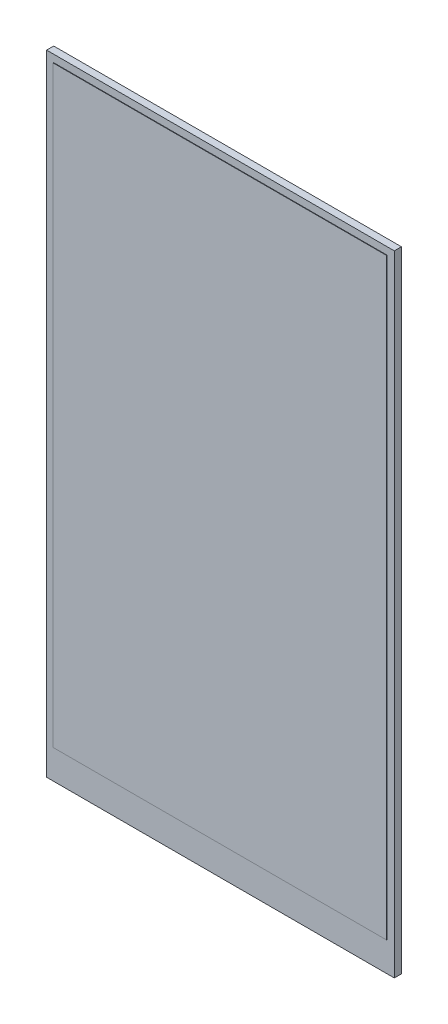
ISO-10303-21;
HEADER;
FILE_DESCRIPTION(('STEP AP214'),'2;1');
FILE_NAME('part.step','',(''),(''),'','','');
FILE_SCHEMA(('AUTOMOTIVE_DESIGN { 1 0 10303 214 1 1 1 1 }'));
ENDSEC;
DATA;
#1=APPLICATION_CONTEXT('core data for automotive mechanical design processes');
#2=APPLICATION_PROTOCOL_DEFINITION('international standard','automotive_design',2000,#1);
#3=PRODUCT_CONTEXT('',#1,'mechanical');
#4=PRODUCT('Part','Part','',(#3));
#5=PRODUCT_RELATED_PRODUCT_CATEGORY('part','',(#4));
#6=PRODUCT_DEFINITION_FORMATION('','',#4);
#7=PRODUCT_DEFINITION_CONTEXT('part definition',#1,'design');
#8=PRODUCT_DEFINITION('design','',#6,#7);
#9=PRODUCT_DEFINITION_SHAPE('','',#8);
#10=(LENGTH_UNIT() NAMED_UNIT(*) SI_UNIT(.MILLI.,.METRE.));
#11=(NAMED_UNIT(*) PLANE_ANGLE_UNIT() SI_UNIT($,.RADIAN.));
#12=(NAMED_UNIT(*) SI_UNIT($,.STERADIAN.) SOLID_ANGLE_UNIT());
#13=UNCERTAINTY_MEASURE_WITH_UNIT(LENGTH_MEASURE(1.E-05),#10,'distance_accuracy_value','');
#14=(GEOMETRIC_REPRESENTATION_CONTEXT(3) GLOBAL_UNCERTAINTY_ASSIGNED_CONTEXT((#13)) GLOBAL_UNIT_ASSIGNED_CONTEXT((#10,
#11,#12)) REPRESENTATION_CONTEXT('',''));
#15=CARTESIAN_POINT('',(0.,0.,0.));
#16=DIRECTION('',(0.,0.,1.));
#17=DIRECTION('',(1.,0.,0.));
#18=AXIS2_PLACEMENT_3D('',#15,#16,#17);
#19=CARTESIAN_POINT('',(0.,0.,1.45));
#20=DIRECTION('',(0.,0.,-1.));
#21=DIRECTION('',(-1.,0.,0.));
#22=AXIS2_PLACEMENT_3D('',#19,#20,#21);
#23=PLANE('',#22);
#24=DIRECTION('',(0.,-1.,0.));
#25=VECTOR('',#24,1.);
#26=CARTESIAN_POINT('',(0.,0.,1.45));
#27=LINE('',#26,#25);
#28=CARTESIAN_POINT('',(0.,128.49,1.45));
#29=VERTEX_POINT('',#28);
#30=CARTESIAN_POINT('',(0.,0.,1.45));
#31=VERTEX_POINT('',#30);
#32=EDGE_CURVE('E141',#29,#31,#27,.T.);
#33=ORIENTED_EDGE('',*,*,#32,.T.);
#34=DIRECTION('',(1.,0.,0.));
#35=VECTOR('',#34,1.);
#36=CARTESIAN_POINT('',(0.,0.,1.45));
#37=LINE('',#36,#35);
#38=CARTESIAN_POINT('',(70.94,0.,1.45));
#39=VERTEX_POINT('',#38);
#40=EDGE_CURVE('E145',#31,#39,#37,.T.);
#41=ORIENTED_EDGE('',*,*,#40,.T.);
#42=DIRECTION('',(0.,1.,0.));
#43=VECTOR('',#42,1.);
#44=CARTESIAN_POINT('',(70.94,0.,1.45));
#45=LINE('',#44,#43);
#46=CARTESIAN_POINT('',(70.94,128.49,1.45));
#47=VERTEX_POINT('',#46);
#48=EDGE_CURVE('E149',#39,#47,#45,.T.);
#49=ORIENTED_EDGE('',*,*,#48,.T.);
#50=DIRECTION('',(-1.,0.,0.));
#51=VECTOR('',#50,1.);
#52=CARTESIAN_POINT('',(0.,128.49,1.45));
#53=LINE('',#52,#51);
#54=EDGE_CURVE('E152',#47,#29,#53,.T.);
#55=ORIENTED_EDGE('',*,*,#54,.T.);
#56=EDGE_LOOP('',(#33,#41,#49,#55));
#57=FACE_BOUND('',#56,.T.);
#58=DIRECTION('',(0.,1.,0.));
#59=VECTOR('',#58,1.);
#60=CARTESIAN_POINT('',(69.49,6.03000000000002,1.45));
#61=LINE('',#60,#59);
#62=CARTESIAN_POINT('',(69.49,6.03000000000002,1.45));
#63=VERTEX_POINT('',#62);
#64=CARTESIAN_POINT('',(69.49,126.99,1.45));
#65=VERTEX_POINT('',#64);
#66=EDGE_CURVE('E57',#63,#65,#61,.T.);
#67=ORIENTED_EDGE('',*,*,#66,.F.);
#68=DIRECTION('',(1.,0.,0.));
#69=VECTOR('',#68,1.);
#70=CARTESIAN_POINT('',(69.49,6.03000000000002,1.45));
#71=LINE('',#70,#69);
#72=CARTESIAN_POINT('',(1.44999999999999,6.03000000000001,1.45));
#73=VERTEX_POINT('',#72);
#74=EDGE_CURVE('E61',#73,#63,#71,.T.);
#75=ORIENTED_EDGE('',*,*,#74,.F.);
#76=DIRECTION('',(0.,-1.,0.));
#77=VECTOR('',#76,1.);
#78=CARTESIAN_POINT('',(1.44999999999999,6.03000000000001,1.45));
#79=LINE('',#78,#77);
#80=CARTESIAN_POINT('',(1.44999999999999,126.99,1.45));
#81=VERTEX_POINT('',#80);
#82=EDGE_CURVE('E287',#81,#73,#79,.T.);
#83=ORIENTED_EDGE('',*,*,#82,.F.);
#84=DIRECTION('',(-1.,0.,0.));
#85=VECTOR('',#84,1.);
#86=CARTESIAN_POINT('',(69.49,126.99,1.45));
#87=LINE('',#86,#85);
#88=EDGE_CURVE('E297',#65,#81,#87,.T.);
#89=ORIENTED_EDGE('',*,*,#88,.F.);
#90=EDGE_LOOP('',(#67,#75,#83,#89));
#91=FACE_BOUND('',#90,.T.);
#92=ADVANCED_FACE('F41',(#57,#91),#23,.F.);
#93=CARTESIAN_POINT('',(0.,0.,1.45));
#94=DIRECTION('',(1.,0.,0.));
#95=DIRECTION('',(0.,0.,-1.));
#96=AXIS2_PLACEMENT_3D('',#93,#94,#95);
#97=PLANE('',#96);
#98=DIRECTION('',(0.,-1.,0.));
#99=VECTOR('',#98,1.);
#100=CARTESIAN_POINT('',(0.,0.,0.));
#101=LINE('',#100,#99);
#102=CARTESIAN_POINT('',(0.,128.49,0.));
#103=VERTEX_POINT('',#102);
#104=CARTESIAN_POINT('',(0.,0.,0.));
#105=VERTEX_POINT('',#104);
#106=EDGE_CURVE('E130',#103,#105,#101,.T.);
#107=ORIENTED_EDGE('',*,*,#106,.T.);
#108=DIRECTION('',(0.,0.,-1.));
#109=VECTOR('',#108,1.);
#110=CARTESIAN_POINT('',(0.,0.,1.45));
#111=LINE('',#110,#109);
#112=EDGE_CURVE('E11',#31,#105,#111,.T.);
#113=ORIENTED_EDGE('',*,*,#112,.F.);
#114=ORIENTED_EDGE('',*,*,#32,.F.);
#115=DIRECTION('',(0.,0.,-1.));
#116=VECTOR('',#115,1.);
#117=CARTESIAN_POINT('',(0.,128.49,1.45));
#118=LINE('',#117,#116);
#119=EDGE_CURVE('E154',#29,#103,#118,.T.);
#120=ORIENTED_EDGE('',*,*,#119,.T.);
#121=EDGE_LOOP('',(#107,#113,#114,#120));
#122=FACE_BOUND('',#121,.T.);
#123=ADVANCED_FACE('F43',(#122),#97,.F.);
#124=CARTESIAN_POINT('',(0.,0.,1.45));
#125=DIRECTION('',(0.,1.,0.));
#126=DIRECTION('',(0.,0.,1.));
#127=AXIS2_PLACEMENT_3D('',#124,#125,#126);
#128=PLANE('',#127);
#129=DIRECTION('',(1.,0.,0.));
#130=VECTOR('',#129,1.);
#131=CARTESIAN_POINT('',(0.,0.,0.));
#132=LINE('',#131,#130);
#133=CARTESIAN_POINT('',(70.94,0.,0.));
#134=VERTEX_POINT('',#133);
#135=EDGE_CURVE('E135',#105,#134,#132,.T.);
#136=ORIENTED_EDGE('',*,*,#135,.T.);
#137=DIRECTION('',(0.,0.,-1.));
#138=VECTOR('',#137,1.);
#139=CARTESIAN_POINT('',(70.94,0.,1.45));
#140=LINE('',#139,#138);
#141=EDGE_CURVE('E50',#39,#134,#140,.T.);
#142=ORIENTED_EDGE('',*,*,#141,.F.);
#143=ORIENTED_EDGE('',*,*,#40,.F.);
#144=ORIENTED_EDGE('',*,*,#112,.T.);
#145=EDGE_LOOP('',(#136,#142,#143,#144));
#146=FACE_BOUND('',#145,.T.);
#147=ADVANCED_FACE('F190',(#146),#128,.F.);
#148=CARTESIAN_POINT('',(70.94,0.,1.45));
#149=DIRECTION('',(-1.,0.,0.));
#150=DIRECTION('',(0.,-1.,0.));
#151=AXIS2_PLACEMENT_3D('',#148,#149,#150);
#152=PLANE('',#151);
#153=DIRECTION('',(0.,1.,0.));
#154=VECTOR('',#153,1.);
#155=CARTESIAN_POINT('',(70.94,0.,0.));
#156=LINE('',#155,#154);
#157=CARTESIAN_POINT('',(70.94,128.49,0.));
#158=VERTEX_POINT('',#157);
#159=EDGE_CURVE('E158',#134,#158,#156,.T.);
#160=ORIENTED_EDGE('',*,*,#159,.T.);
#161=DIRECTION('',(0.,0.,-1.));
#162=VECTOR('',#161,1.);
#163=CARTESIAN_POINT('',(70.94,128.49,1.45));
#164=LINE('',#163,#162);
#165=EDGE_CURVE('E166',#47,#158,#164,.T.);
#166=ORIENTED_EDGE('',*,*,#165,.F.);
#167=ORIENTED_EDGE('',*,*,#48,.F.);
#168=ORIENTED_EDGE('',*,*,#141,.T.);
#169=EDGE_LOOP('',(#160,#166,#167,#168));
#170=FACE_BOUND('',#169,.T.);
#171=ADVANCED_FACE('F175',(#170),#152,.F.);
#172=CARTESIAN_POINT('',(0.,128.49,1.45));
#173=DIRECTION('',(0.,-1.,0.));
#174=DIRECTION('',(0.,0.,-1.));
#175=AXIS2_PLACEMENT_3D('',#172,#173,#174);
#176=PLANE('',#175);
#177=DIRECTION('',(-1.,0.,0.));
#178=VECTOR('',#177,1.);
#179=CARTESIAN_POINT('',(0.,128.49,0.));
#180=LINE('',#179,#178);
#181=EDGE_CURVE('E146',#158,#103,#180,.T.);
#182=ORIENTED_EDGE('',*,*,#181,.T.);
#183=ORIENTED_EDGE('',*,*,#119,.F.);
#184=ORIENTED_EDGE('',*,*,#54,.F.);
#185=ORIENTED_EDGE('',*,*,#165,.T.);
#186=EDGE_LOOP('',(#182,#183,#184,#185));
#187=FACE_BOUND('',#186,.T.);
#188=ADVANCED_FACE('F184',(#187),#176,.F.);
#189=CARTESIAN_POINT('',(0.,0.,0.));
#190=DIRECTION('',(0.,0.,-1.));
#191=DIRECTION('',(-1.,0.,0.));
#192=AXIS2_PLACEMENT_3D('',#189,#190,#191);
#193=PLANE('',#192);
#194=ORIENTED_EDGE('',*,*,#106,.F.);
#195=ORIENTED_EDGE('',*,*,#181,.F.);
#196=ORIENTED_EDGE('',*,*,#159,.F.);
#197=ORIENTED_EDGE('',*,*,#135,.F.);
#198=EDGE_LOOP('',(#194,#195,#196,#197));
#199=FACE_BOUND('',#198,.T.);
#200=ADVANCED_FACE('F181',(#199),#193,.T.);
#201=CARTESIAN_POINT('',(69.49,6.03000000000002,1.55));
#202=DIRECTION('',(-1.,0.,0.));
#203=DIRECTION('',(0.,0.,1.));
#204=AXIS2_PLACEMENT_3D('',#201,#202,#203);
#205=PLANE('',#204);
#206=ORIENTED_EDGE('',*,*,#66,.T.);
#207=DIRECTION('',(0.,0.,-1.));
#208=VECTOR('',#207,1.);
#209=CARTESIAN_POINT('',(69.49,126.99,1.55));
#210=LINE('',#209,#208);
#211=CARTESIAN_POINT('',(69.49,126.99,1.55));
#212=VERTEX_POINT('',#211);
#213=EDGE_CURVE('E110',#212,#65,#210,.T.);
#214=ORIENTED_EDGE('',*,*,#213,.F.);
#215=DIRECTION('',(0.,1.,0.));
#216=VECTOR('',#215,1.);
#217=CARTESIAN_POINT('',(69.49,6.03000000000002,1.55));
#218=LINE('',#217,#216);
#219=CARTESIAN_POINT('',(69.49,6.03000000000002,1.55));
#220=VERTEX_POINT('',#219);
#221=EDGE_CURVE('E117',#220,#212,#218,.T.);
#222=ORIENTED_EDGE('',*,*,#221,.F.);
#223=DIRECTION('',(0.,0.,-1.));
#224=VECTOR('',#223,1.);
#225=CARTESIAN_POINT('',(69.49,6.03000000000002,1.55));
#226=LINE('',#225,#224);
#227=EDGE_CURVE('E284',#220,#63,#226,.T.);
#228=ORIENTED_EDGE('',*,*,#227,.T.);
#229=EDGE_LOOP('',(#206,#214,#222,#228));
#230=FACE_BOUND('',#229,.T.);
#231=ADVANCED_FACE('F128',(#230),#205,.F.);
#232=CARTESIAN_POINT('',(69.49,126.99,1.55));
#233=DIRECTION('',(0.,-1.,0.));
#234=DIRECTION('',(0.,0.,-1.));
#235=AXIS2_PLACEMENT_3D('',#232,#233,#234);
#236=PLANE('',#235);
#237=ORIENTED_EDGE('',*,*,#88,.T.);
#238=DIRECTION('',(0.,0.,-1.));
#239=VECTOR('',#238,1.);
#240=CARTESIAN_POINT('',(1.44999999999999,126.99,1.55));
#241=LINE('',#240,#239);
#242=CARTESIAN_POINT('',(1.44999999999999,126.99,1.55));
#243=VERTEX_POINT('',#242);
#244=EDGE_CURVE('E112',#243,#81,#241,.T.);
#245=ORIENTED_EDGE('',*,*,#244,.F.);
#246=DIRECTION('',(-1.,0.,0.));
#247=VECTOR('',#246,1.);
#248=CARTESIAN_POINT('',(69.49,126.99,1.55));
#249=LINE('',#248,#247);
#250=EDGE_CURVE('E105',#212,#243,#249,.T.);
#251=ORIENTED_EDGE('',*,*,#250,.F.);
#252=ORIENTED_EDGE('',*,*,#213,.T.);
#253=EDGE_LOOP('',(#237,#245,#251,#252));
#254=FACE_BOUND('',#253,.T.);
#255=ADVANCED_FACE('F108',(#254),#236,.F.);
#256=CARTESIAN_POINT('',(1.44999999999999,6.03000000000001,1.55));
#257=DIRECTION('',(1.,0.,0.));
#258=DIRECTION('',(0.,0.,-1.));
#259=AXIS2_PLACEMENT_3D('',#256,#257,#258);
#260=PLANE('',#259);
#261=ORIENTED_EDGE('',*,*,#82,.T.);
#262=DIRECTION('',(0.,0.,-1.));
#263=VECTOR('',#262,1.);
#264=CARTESIAN_POINT('',(1.44999999999999,6.03000000000001,1.55));
#265=LINE('',#264,#263);
#266=CARTESIAN_POINT('',(1.44999999999999,6.03000000000001,1.55));
#267=VERTEX_POINT('',#266);
#268=EDGE_CURVE('E137',#267,#73,#265,.T.);
#269=ORIENTED_EDGE('',*,*,#268,.F.);
#270=DIRECTION('',(0.,-1.,0.));
#271=VECTOR('',#270,1.);
#272=CARTESIAN_POINT('',(1.44999999999999,6.03000000000001,1.55));
#273=LINE('',#272,#271);
#274=EDGE_CURVE('E116',#243,#267,#273,.T.);
#275=ORIENTED_EDGE('',*,*,#274,.F.);
#276=ORIENTED_EDGE('',*,*,#244,.T.);
#277=EDGE_LOOP('',(#261,#269,#275,#276));
#278=FACE_BOUND('',#277,.T.);
#279=ADVANCED_FACE('F226',(#278),#260,.F.);
#280=CARTESIAN_POINT('',(69.49,6.03000000000002,1.55));
#281=DIRECTION('',(0.,1.,0.));
#282=DIRECTION('',(-1.,0.,0.));
#283=AXIS2_PLACEMENT_3D('',#280,#281,#282);
#284=PLANE('',#283);
#285=ORIENTED_EDGE('',*,*,#74,.T.);
#286=ORIENTED_EDGE('',*,*,#227,.F.);
#287=DIRECTION('',(1.,0.,0.));
#288=VECTOR('',#287,1.);
#289=CARTESIAN_POINT('',(69.49,6.03000000000002,1.55));
#290=LINE('',#289,#288);
#291=EDGE_CURVE('E122',#267,#220,#290,.T.);
#292=ORIENTED_EDGE('',*,*,#291,.F.);
#293=ORIENTED_EDGE('',*,*,#268,.T.);
#294=EDGE_LOOP('',(#285,#286,#292,#293));
#295=FACE_BOUND('',#294,.T.);
#296=ADVANCED_FACE('F232',(#295),#284,.F.);
#297=CARTESIAN_POINT('',(0.,0.,1.55));
#298=DIRECTION('',(0.,0.,1.));
#299=DIRECTION('',(1.,0.,0.));
#300=AXIS2_PLACEMENT_3D('',#297,#298,#299);
#301=PLANE('',#300);
#302=ORIENTED_EDGE('',*,*,#221,.T.);
#303=ORIENTED_EDGE('',*,*,#250,.T.);
#304=ORIENTED_EDGE('',*,*,#274,.T.);
#305=ORIENTED_EDGE('',*,*,#291,.T.);
#306=EDGE_LOOP('',(#302,#303,#304,#305));
#307=FACE_BOUND('',#306,.T.);
#308=ADVANCED_FACE('F120',(#307),#301,.T.);
#309=CLOSED_SHELL('',(#92,#123,#147,#171,#188,#200,#231,#255,#279,#296,#308));
#310=MANIFOLD_SOLID_BREP('B2',#309);
#311=ADVANCED_BREP_SHAPE_REPRESENTATION('',(#18,#310),#14);
#312=SHAPE_DEFINITION_REPRESENTATION(#9,#311);
ENDSEC;
END-ISO-10303-21;
